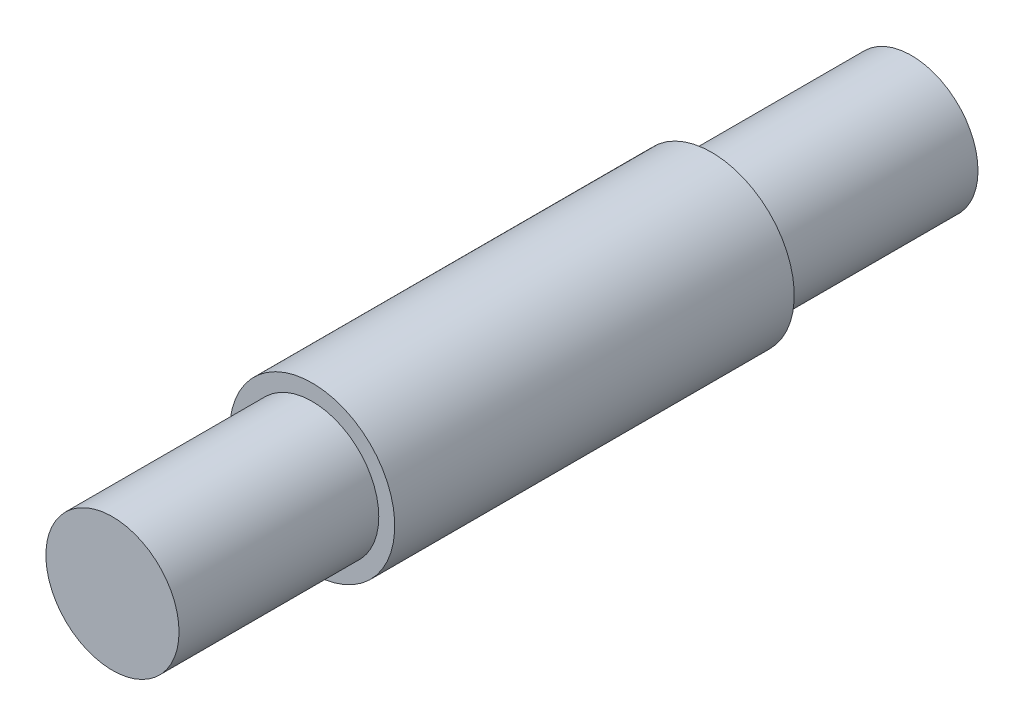
ISO-10303-21;
HEADER;
FILE_DESCRIPTION(('STEP AP214'),'2;1');
FILE_NAME('part.step','',(''),(''),'','','');
FILE_SCHEMA(('AUTOMOTIVE_DESIGN { 1 0 10303 214 1 1 1 1 }'));
ENDSEC;
DATA;
#1=APPLICATION_CONTEXT('core data for automotive mechanical design processes');
#2=APPLICATION_PROTOCOL_DEFINITION('international standard','automotive_design',2000,#1);
#3=PRODUCT_CONTEXT('',#1,'mechanical');
#4=PRODUCT('Part','Part','',(#3));
#5=PRODUCT_RELATED_PRODUCT_CATEGORY('part','',(#4));
#6=PRODUCT_DEFINITION_FORMATION('','',#4);
#7=PRODUCT_DEFINITION_CONTEXT('part definition',#1,'design');
#8=PRODUCT_DEFINITION('design','',#6,#7);
#9=PRODUCT_DEFINITION_SHAPE('','',#8);
#10=(LENGTH_UNIT() NAMED_UNIT(*) SI_UNIT(.MILLI.,.METRE.));
#11=(NAMED_UNIT(*) PLANE_ANGLE_UNIT() SI_UNIT($,.RADIAN.));
#12=(NAMED_UNIT(*) SI_UNIT($,.STERADIAN.) SOLID_ANGLE_UNIT());
#13=UNCERTAINTY_MEASURE_WITH_UNIT(LENGTH_MEASURE(1.E-05),#10,'distance_accuracy_value','');
#14=(GEOMETRIC_REPRESENTATION_CONTEXT(3) GLOBAL_UNCERTAINTY_ASSIGNED_CONTEXT((#13)) GLOBAL_UNIT_ASSIGNED_CONTEXT((#10,
#11,#12)) REPRESENTATION_CONTEXT('',''));
#15=CARTESIAN_POINT('',(0.,0.,0.));
#16=DIRECTION('',(0.,0.,1.));
#17=DIRECTION('',(1.,0.,0.));
#18=AXIS2_PLACEMENT_3D('',#15,#16,#17);
#19=CARTESIAN_POINT('',(0.,0.,19.05));
#20=DIRECTION('',(0.,0.,-1.));
#21=DIRECTION('',(-1.,0.,0.));
#22=AXIS2_PLACEMENT_3D('',#19,#20,#21);
#23=CYLINDRICAL_SURFACE('',#22,3.937);
#24=CARTESIAN_POINT('',(0.,0.,19.05));
#25=DIRECTION('',(0.,0.,1.));
#26=DIRECTION('',(1.,0.,0.));
#27=AXIS2_PLACEMENT_3D('',#24,#25,#26);
#28=CIRCLE('',#27,3.937);
#29=CARTESIAN_POINT('',(-3.937,0.,19.05));
#30=VERTEX_POINT('',#29);
#31=EDGE_CURVE('E43',#30,#30,#28,.T.);
#32=CARTESIAN_POINT('',(0.,0.,0.));
#33=DIRECTION('',(0.,0.,1.));
#34=DIRECTION('',(1.,0.,0.));
#35=AXIS2_PLACEMENT_3D('',#32,#33,#34);
#36=CIRCLE('',#35,3.937);
#37=CARTESIAN_POINT('',(-3.937,0.,0.));
#38=VERTEX_POINT('',#37);
#39=EDGE_CURVE('E48',#38,#38,#36,.T.);
#40=CARTESIAN_POINT('',(-3.937,0.,19.05));
#41=CARTESIAN_POINT('',(-3.937,0.,18.8515625));
#42=CARTESIAN_POINT('',(-3.937,0.,18.653125));
#43=CARTESIAN_POINT('',(-3.937,0.,18.25625));
#44=CARTESIAN_POINT('',(-3.937,0.,18.0578125));
#45=CARTESIAN_POINT('',(-3.937,0.,17.6609375));
#46=CARTESIAN_POINT('',(-3.937,0.,17.4625));
#47=CARTESIAN_POINT('',(-3.937,0.,17.065625));
#48=CARTESIAN_POINT('',(-3.937,0.,16.8671875));
#49=CARTESIAN_POINT('',(-3.937,0.,16.4703125));
#50=CARTESIAN_POINT('',(-3.937,0.,16.271875));
#51=CARTESIAN_POINT('',(-3.937,0.,15.875));
#52=CARTESIAN_POINT('',(-3.937,0.,15.6765625));
#53=CARTESIAN_POINT('',(-3.937,0.,15.2796875));
#54=CARTESIAN_POINT('',(-3.937,0.,15.08125));
#55=CARTESIAN_POINT('',(-3.937,0.,14.684375));
#56=CARTESIAN_POINT('',(-3.937,0.,14.4859375));
#57=CARTESIAN_POINT('',(-3.937,0.,14.0890625));
#58=CARTESIAN_POINT('',(-3.937,0.,13.890625));
#59=CARTESIAN_POINT('',(-3.937,0.,13.49375));
#60=CARTESIAN_POINT('',(-3.937,0.,13.2953125));
#61=CARTESIAN_POINT('',(-3.937,0.,12.8984375));
#62=CARTESIAN_POINT('',(-3.937,0.,12.7));
#63=CARTESIAN_POINT('',(-3.937,0.,12.303125));
#64=CARTESIAN_POINT('',(-3.937,0.,12.1046875));
#65=CARTESIAN_POINT('',(-3.937,0.,11.7078125));
#66=CARTESIAN_POINT('',(-3.937,0.,11.509375));
#67=CARTESIAN_POINT('',(-3.937,0.,11.1125));
#68=CARTESIAN_POINT('',(-3.937,0.,10.9140625));
#69=CARTESIAN_POINT('',(-3.937,0.,10.5171875));
#70=CARTESIAN_POINT('',(-3.937,0.,10.31875));
#71=CARTESIAN_POINT('',(-3.937,0.,9.921875));
#72=CARTESIAN_POINT('',(-3.937,0.,9.7234375));
#73=CARTESIAN_POINT('',(-3.937,0.,9.3265625));
#74=CARTESIAN_POINT('',(-3.937,0.,9.128125));
#75=CARTESIAN_POINT('',(-3.937,0.,8.73125));
#76=CARTESIAN_POINT('',(-3.937,0.,8.5328125));
#77=CARTESIAN_POINT('',(-3.937,0.,8.1359375));
#78=CARTESIAN_POINT('',(-3.937,0.,7.9375));
#79=CARTESIAN_POINT('',(-3.937,0.,7.540625));
#80=CARTESIAN_POINT('',(-3.937,0.,7.3421875));
#81=CARTESIAN_POINT('',(-3.937,0.,6.9453125));
#82=CARTESIAN_POINT('',(-3.937,0.,6.746875));
#83=CARTESIAN_POINT('',(-3.937,0.,6.35));
#84=CARTESIAN_POINT('',(-3.937,0.,6.1515625));
#85=CARTESIAN_POINT('',(-3.937,0.,5.7546875));
#86=CARTESIAN_POINT('',(-3.937,0.,5.55625));
#87=CARTESIAN_POINT('',(-3.937,0.,5.159375));
#88=CARTESIAN_POINT('',(-3.937,0.,4.9609375));
#89=CARTESIAN_POINT('',(-3.937,0.,4.5640625));
#90=CARTESIAN_POINT('',(-3.937,0.,4.365625));
#91=CARTESIAN_POINT('',(-3.937,0.,3.96875));
#92=CARTESIAN_POINT('',(-3.937,0.,3.7703125));
#93=CARTESIAN_POINT('',(-3.937,0.,3.3734375));
#94=CARTESIAN_POINT('',(-3.937,0.,3.175));
#95=CARTESIAN_POINT('',(-3.937,0.,2.778125));
#96=CARTESIAN_POINT('',(-3.937,0.,2.5796875));
#97=CARTESIAN_POINT('',(-3.937,0.,2.1828125));
#98=CARTESIAN_POINT('',(-3.937,0.,1.984375));
#99=CARTESIAN_POINT('',(-3.937,0.,1.5875));
#100=CARTESIAN_POINT('',(-3.937,0.,1.3890625));
#101=CARTESIAN_POINT('',(-3.937,0.,0.992187500000001));
#102=CARTESIAN_POINT('',(-3.937,0.,0.793750000000001));
#103=CARTESIAN_POINT('',(-3.937,0.,0.396875));
#104=CARTESIAN_POINT('',(-3.937,0.,0.1984375));
#105=CARTESIAN_POINT('',(-3.937,0.,0.));
#106=B_SPLINE_CURVE_WITH_KNOTS('',3,(#40,#41,#42,#43,#44,#45,#46,#47,#48,#49,#50,#51,#52,#53,
#54,#55,#56,#57,#58,#59,#60,#61,#62,#63,#64,#65,#66,#67,#68,#69,#70,#71,#72,#73,#74,#75,#76,#77,
#78,#79,#80,#81,#82,#83,#84,#85,#86,#87,#88,#89,#90,#91,#92,#93,#94,#95,#96,#97,#98,#99,#100,
#101,#102,#103,#104,#105),.UNSPECIFIED.,.F.,.F.,(4,2,2,2,2,2,2,2,2,2,2,2,2,2,2,2,2,2,2,2,2,2,2,
2,2,2,2,2,2,2,2,2,4),(0.,0.595312499999997,1.190625,1.7859375,2.38125,2.9765625,3.571875,
4.1671875,4.7625,5.3578125,5.953125,6.5484375,7.14375,7.7390625,8.334375,8.9296875,9.525,
10.1203125,10.715625,11.3109375,11.90625,12.5015625,13.096875,13.6921875,14.2875,14.8828125,
15.478125,16.0734375,16.66875,17.2640625,17.859375,18.4546875,19.05),.UNSPECIFIED.);
#107=EDGE_CURVE('BSEAM36',#30,#38,#106,.T.);
#108=ORIENTED_EDGE('',*,*,#31,.F.);
#109=ORIENTED_EDGE('',*,*,#39,.T.);
#110=ORIENTED_EDGE('',*,*,#107,.T.);
#111=ORIENTED_EDGE('',*,*,#107,.F.);
#112=EDGE_LOOP('',(#108,#110,#109,#111));
#113=FACE_BOUND('',#112,.T.);
#114=ADVANCED_FACE('F36',(#113),#23,.T.);
#115=CARTESIAN_POINT('',(0.,0.,19.05));
#116=DIRECTION('',(0.,0.,1.));
#117=DIRECTION('',(1.,0.,0.));
#118=AXIS2_PLACEMENT_3D('',#115,#116,#117);
#119=PLANE('',#118);
#120=CARTESIAN_POINT('',(0.,0.,19.05));
#121=DIRECTION('',(0.,0.,1.));
#122=DIRECTION('',(1.,0.,0.));
#123=AXIS2_PLACEMENT_3D('',#120,#121,#122);
#124=CIRCLE('',#123,3.175);
#125=CARTESIAN_POINT('',(3.175,0.,19.05));
#126=VERTEX_POINT('',#125);
#127=EDGE_CURVE('E10',#126,#126,#124,.T.);
#128=ORIENTED_EDGE('',*,*,#127,.F.);
#129=EDGE_LOOP('',(#128));
#130=FACE_BOUND('',#129,.T.);
#131=ORIENTED_EDGE('',*,*,#31,.T.);
#132=EDGE_LOOP('',(#131));
#133=FACE_BOUND('',#132,.T.);
#134=ADVANCED_FACE('F81',(#130,#133),#119,.T.);
#135=CARTESIAN_POINT('',(0.,0.,0.));
#136=DIRECTION('',(0.,0.,1.));
#137=DIRECTION('',(1.,0.,0.));
#138=AXIS2_PLACEMENT_3D('',#135,#136,#137);
#139=PLANE('',#138);
#140=CARTESIAN_POINT('',(0.,0.,0.));
#141=DIRECTION('',(0.,0.,1.));
#142=DIRECTION('',(1.,0.,0.));
#143=AXIS2_PLACEMENT_3D('',#140,#141,#142);
#144=CIRCLE('',#143,3.175);
#145=CARTESIAN_POINT('',(3.175,0.,0.));
#146=VERTEX_POINT('',#145);
#147=EDGE_CURVE('E39',#146,#146,#144,.T.);
#148=ORIENTED_EDGE('',*,*,#147,.T.);
#149=EDGE_LOOP('',(#148));
#150=FACE_BOUND('',#149,.T.);
#151=ORIENTED_EDGE('',*,*,#39,.F.);
#152=EDGE_LOOP('',(#151));
#153=FACE_BOUND('',#152,.T.);
#154=ADVANCED_FACE('F86',(#150,#153),#139,.F.);
#155=CARTESIAN_POINT('',(0.,0.,-9.525));
#156=DIRECTION('',(0.,0.,1.));
#157=DIRECTION('',(1.,0.,0.));
#158=AXIS2_PLACEMENT_3D('',#155,#156,#157);
#159=PLANE('',#158);
#160=CARTESIAN_POINT('',(0.,0.,-9.525));
#161=DIRECTION('',(0.,0.,1.));
#162=DIRECTION('',(1.,0.,0.));
#163=AXIS2_PLACEMENT_3D('',#160,#161,#162);
#164=CIRCLE('',#163,3.175);
#165=CARTESIAN_POINT('',(3.175,0.,-9.525));
#166=VERTEX_POINT('',#165);
#167=EDGE_CURVE('E51',#166,#166,#164,.T.);
#168=ORIENTED_EDGE('',*,*,#167,.F.);
#169=EDGE_LOOP('',(#168));
#170=FACE_BOUND('',#169,.T.);
#171=ADVANCED_FACE('F77',(#170),#159,.F.);
#172=CARTESIAN_POINT('',(0.,0.,-9.525));
#173=DIRECTION('',(0.,0.,1.));
#174=DIRECTION('',(1.,0.,0.));
#175=AXIS2_PLACEMENT_3D('',#172,#173,#174);
#176=CYLINDRICAL_SURFACE('',#175,3.175);
#177=ORIENTED_EDGE('',*,*,#167,.T.);
#178=EDGE_LOOP('',(#177));
#179=FACE_BOUND('',#178,.T.);
#180=ORIENTED_EDGE('',*,*,#147,.F.);
#181=EDGE_LOOP('',(#180));
#182=FACE_BOUND('',#181,.T.);
#183=ADVANCED_FACE('F70',(#179,#182),#176,.T.);
#184=ORIENTED_EDGE('',*,*,#127,.T.);
#185=EDGE_LOOP('',(#184));
#186=FACE_BOUND('',#185,.T.);
#187=CARTESIAN_POINT('',(0.,0.,28.575));
#188=DIRECTION('',(0.,0.,1.));
#189=DIRECTION('',(1.,0.,0.));
#190=AXIS2_PLACEMENT_3D('',#187,#188,#189);
#191=CIRCLE('',#190,3.175);
#192=CARTESIAN_POINT('',(3.175,0.,28.575));
#193=VERTEX_POINT('',#192);
#194=EDGE_CURVE('E60',#193,#193,#191,.T.);
#195=ORIENTED_EDGE('',*,*,#194,.F.);
#196=EDGE_LOOP('',(#195));
#197=FACE_BOUND('',#196,.T.);
#198=ADVANCED_FACE('F68',(#186,#197),#176,.T.);
#199=CARTESIAN_POINT('',(0.,0.,28.575));
#200=DIRECTION('',(0.,0.,1.));
#201=DIRECTION('',(1.,0.,0.));
#202=AXIS2_PLACEMENT_3D('',#199,#200,#201);
#203=PLANE('',#202);
#204=ORIENTED_EDGE('',*,*,#194,.T.);
#205=EDGE_LOOP('',(#204));
#206=FACE_BOUND('',#205,.T.);
#207=ADVANCED_FACE('F66',(#206),#203,.T.);
#208=CLOSED_SHELL('',(#114,#134,#154,#171,#183,#198,#207));
#209=MANIFOLD_SOLID_BREP('B2',#208);
#210=ADVANCED_BREP_SHAPE_REPRESENTATION('',(#18,#209),#14);
#211=SHAPE_DEFINITION_REPRESENTATION(#9,#210);
ENDSEC;
END-ISO-10303-21;
